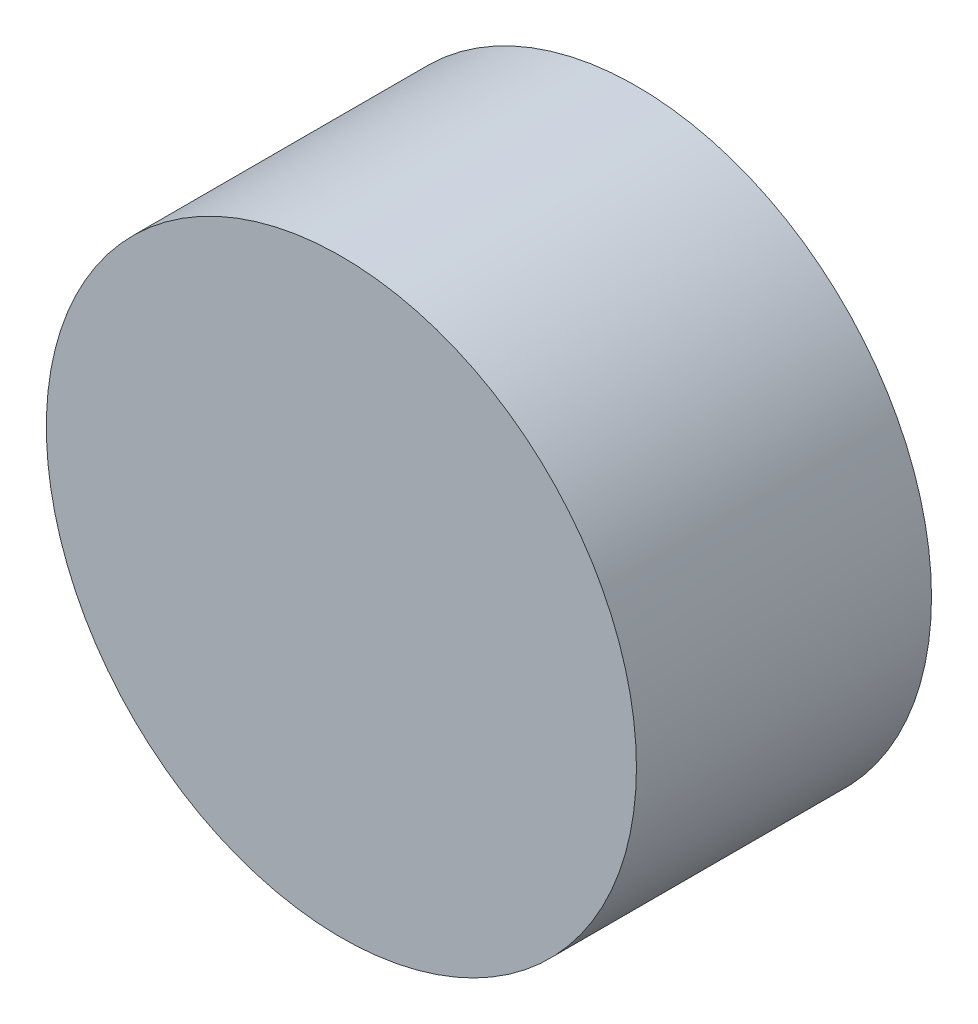
ISO-10303-21;
HEADER;
FILE_DESCRIPTION(('STEP AP214'),'2;1');
FILE_NAME('part.step','',(''),(''),'','','');
FILE_SCHEMA(('AUTOMOTIVE_DESIGN { 1 0 10303 214 1 1 1 1 }'));
ENDSEC;
DATA;
#1=APPLICATION_CONTEXT('core data for automotive mechanical design processes');
#2=APPLICATION_PROTOCOL_DEFINITION('international standard','automotive_design',2000,#1);
#3=PRODUCT_CONTEXT('',#1,'mechanical');
#4=PRODUCT('Part','Part','',(#3));
#5=PRODUCT_RELATED_PRODUCT_CATEGORY('part','',(#4));
#6=PRODUCT_DEFINITION_FORMATION('','',#4);
#7=PRODUCT_DEFINITION_CONTEXT('part definition',#1,'design');
#8=PRODUCT_DEFINITION('design','',#6,#7);
#9=PRODUCT_DEFINITION_SHAPE('','',#8);
#10=(LENGTH_UNIT() NAMED_UNIT(*) SI_UNIT(.MILLI.,.METRE.));
#11=(NAMED_UNIT(*) PLANE_ANGLE_UNIT() SI_UNIT($,.RADIAN.));
#12=(NAMED_UNIT(*) SI_UNIT($,.STERADIAN.) SOLID_ANGLE_UNIT());
#13=UNCERTAINTY_MEASURE_WITH_UNIT(LENGTH_MEASURE(1.E-05),#10,'distance_accuracy_value','');
#14=(GEOMETRIC_REPRESENTATION_CONTEXT(3) GLOBAL_UNCERTAINTY_ASSIGNED_CONTEXT((#13)) GLOBAL_UNIT_ASSIGNED_CONTEXT((#10,
#11,#12)) REPRESENTATION_CONTEXT('',''));
#15=CARTESIAN_POINT('',(0.,0.,0.));
#16=DIRECTION('',(0.,0.,1.));
#17=DIRECTION('',(1.,0.,0.));
#18=AXIS2_PLACEMENT_3D('',#15,#16,#17);
#19=CARTESIAN_POINT('',(0.,0.,15.));
#20=DIRECTION('',(0.,0.,-1.));
#21=DIRECTION('',(-1.,0.,0.));
#22=AXIS2_PLACEMENT_3D('',#19,#20,#21);
#23=CYLINDRICAL_SURFACE('',#22,15.);
#24=CARTESIAN_POINT('',(0.,0.,15.));
#25=DIRECTION('',(0.,0.,1.));
#26=DIRECTION('',(1.,0.,0.));
#27=AXIS2_PLACEMENT_3D('',#24,#25,#26);
#28=CIRCLE('',#27,15.);
#29=CARTESIAN_POINT('',(15.,0.,15.));
#30=VERTEX_POINT('',#29);
#31=EDGE_CURVE('E10',#30,#30,#28,.T.);
#32=ORIENTED_EDGE('',*,*,#31,.F.);
#33=EDGE_LOOP('',(#32));
#34=FACE_BOUND('',#33,.T.);
#35=CARTESIAN_POINT('',(0.,0.,0.));
#36=DIRECTION('',(0.,0.,1.));
#37=DIRECTION('',(1.,0.,0.));
#38=AXIS2_PLACEMENT_3D('',#35,#36,#37);
#39=CIRCLE('',#38,15.);
#40=CARTESIAN_POINT('',(15.,0.,0.));
#41=VERTEX_POINT('',#40);
#42=EDGE_CURVE('E46',#41,#41,#39,.T.);
#43=ORIENTED_EDGE('',*,*,#42,.T.);
#44=EDGE_LOOP('',(#43));
#45=FACE_BOUND('',#44,.T.);
#46=ADVANCED_FACE('F43',(#34,#45),#23,.T.);
#47=CARTESIAN_POINT('',(0.,0.,15.));
#48=DIRECTION('',(0.,0.,1.));
#49=DIRECTION('',(1.,0.,0.));
#50=AXIS2_PLACEMENT_3D('',#47,#48,#49);
#51=PLANE('',#50);
#52=ORIENTED_EDGE('',*,*,#31,.T.);
#53=EDGE_LOOP('',(#52));
#54=FACE_BOUND('',#53,.T.);
#55=ADVANCED_FACE('F58',(#54),#51,.T.);
#56=CARTESIAN_POINT('',(0.,0.,0.));
#57=DIRECTION('',(0.,0.,1.));
#58=DIRECTION('',(1.,0.,0.));
#59=AXIS2_PLACEMENT_3D('',#56,#57,#58);
#60=PLANE('',#59);
#61=ORIENTED_EDGE('',*,*,#42,.F.);
#62=EDGE_LOOP('',(#61));
#63=FACE_BOUND('',#62,.T.);
#64=ADVANCED_FACE('F59',(#63),#60,.F.);
#65=CLOSED_SHELL('',(#46,#55,#64));
#66=MANIFOLD_SOLID_BREP('B2',#65);
#67=ADVANCED_BREP_SHAPE_REPRESENTATION('',(#18,#66),#14);
#68=SHAPE_DEFINITION_REPRESENTATION(#9,#67);
ENDSEC;
END-ISO-10303-21;
